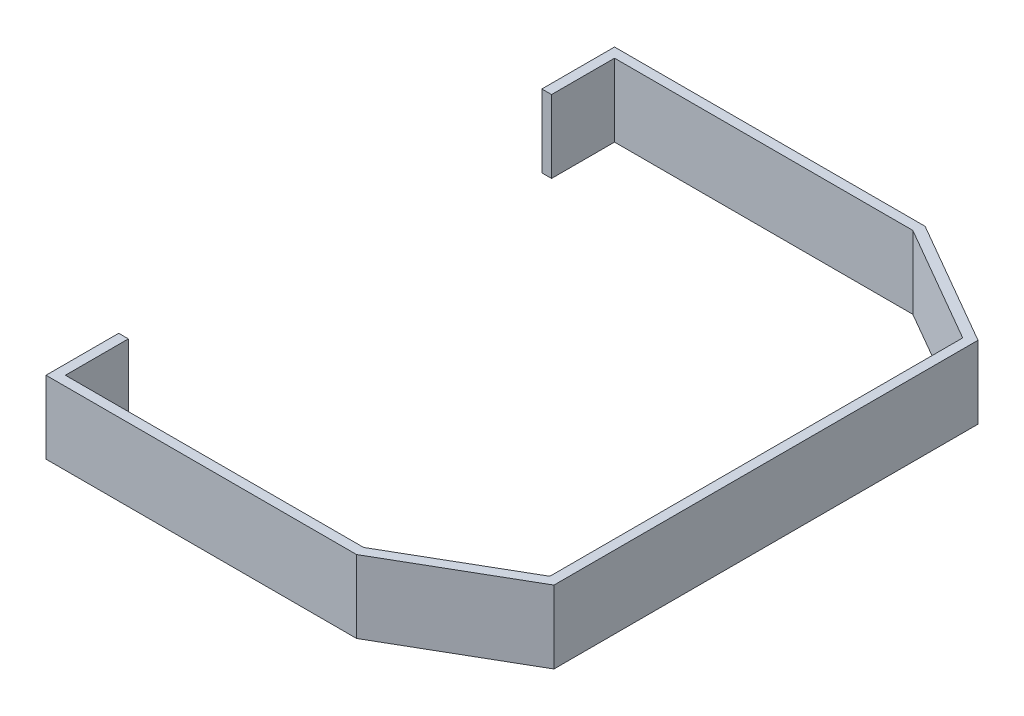
ISO-10303-21;
HEADER;
FILE_DESCRIPTION(('STEP AP214'),'2;1');
FILE_NAME('part.step','',(''),(''),'','','');
FILE_SCHEMA(('AUTOMOTIVE_DESIGN { 1 0 10303 214 1 1 1 1 }'));
ENDSEC;
DATA;
#1=APPLICATION_CONTEXT('core data for automotive mechanical design processes');
#2=APPLICATION_PROTOCOL_DEFINITION('international standard','automotive_design',2000,#1);
#3=PRODUCT_CONTEXT('',#1,'mechanical');
#4=PRODUCT('Part','Part','',(#3));
#5=PRODUCT_RELATED_PRODUCT_CATEGORY('part','',(#4));
#6=PRODUCT_DEFINITION_FORMATION('','',#4);
#7=PRODUCT_DEFINITION_CONTEXT('part definition',#1,'design');
#8=PRODUCT_DEFINITION('design','',#6,#7);
#9=PRODUCT_DEFINITION_SHAPE('','',#8);
#10=(LENGTH_UNIT() NAMED_UNIT(*) SI_UNIT(.MILLI.,.METRE.));
#11=(NAMED_UNIT(*) PLANE_ANGLE_UNIT() SI_UNIT($,.RADIAN.));
#12=(NAMED_UNIT(*) SI_UNIT($,.STERADIAN.) SOLID_ANGLE_UNIT());
#13=UNCERTAINTY_MEASURE_WITH_UNIT(LENGTH_MEASURE(1.E-05),#10,'distance_accuracy_value','');
#14=(GEOMETRIC_REPRESENTATION_CONTEXT(3) GLOBAL_UNCERTAINTY_ASSIGNED_CONTEXT((#13)) GLOBAL_UNIT_ASSIGNED_CONTEXT((#10,
#11,#12)) REPRESENTATION_CONTEXT('',''));
#15=CARTESIAN_POINT('',(0.,0.,0.));
#16=DIRECTION('',(0.,0.,1.));
#17=DIRECTION('',(1.,0.,0.));
#18=AXIS2_PLACEMENT_3D('',#15,#16,#17);
#19=CARTESIAN_POINT('',(-37.5,30.,-117.32));
#20=DIRECTION('',(1.,0.,0.));
#21=DIRECTION('',(0.,0.,-1.));
#22=AXIS2_PLACEMENT_3D('',#19,#20,#21);
#23=PLANE('',#22);
#24=DIRECTION('',(0.,0.,1.));
#25=VECTOR('',#24,1.);
#26=CARTESIAN_POINT('',(-37.5,0.,-117.32));
#27=LINE('',#26,#25);
#28=CARTESIAN_POINT('',(-37.5,0.,-117.32));
#29=VERTEX_POINT('',#28);
#30=CARTESIAN_POINT('',(-37.5,0.,-87.3199999999999));
#31=VERTEX_POINT('',#30);
#32=EDGE_CURVE('E182',#29,#31,#27,.T.);
#33=ORIENTED_EDGE('',*,*,#32,.T.);
#34=DIRECTION('',(0.,-1.,0.));
#35=VECTOR('',#34,1.);
#36=CARTESIAN_POINT('',(-37.5,30.,-87.3199999999999));
#37=LINE('',#36,#35);
#38=CARTESIAN_POINT('',(-37.5,30.,-87.3199999999999));
#39=VERTEX_POINT('',#38);
#40=EDGE_CURVE('E11',#39,#31,#37,.T.);
#41=ORIENTED_EDGE('',*,*,#40,.F.);
#42=DIRECTION('',(0.,0.,1.));
#43=VECTOR('',#42,1.);
#44=CARTESIAN_POINT('',(-37.5,30.,-117.32));
#45=LINE('',#44,#43);
#46=CARTESIAN_POINT('',(-37.5,30.,-117.32));
#47=VERTEX_POINT('',#46);
#48=EDGE_CURVE('E216',#47,#39,#45,.T.);
#49=ORIENTED_EDGE('',*,*,#48,.F.);
#50=DIRECTION('',(0.,-1.,0.));
#51=VECTOR('',#50,1.);
#52=CARTESIAN_POINT('',(-37.5,30.,-117.32));
#53=LINE('',#52,#51);
#54=EDGE_CURVE('E178',#47,#29,#53,.T.);
#55=ORIENTED_EDGE('',*,*,#54,.T.);
#56=EDGE_LOOP('',(#33,#41,#49,#55));
#57=FACE_BOUND('',#56,.T.);
#58=ADVANCED_FACE('F37',(#57),#23,.F.);
#59=CARTESIAN_POINT('',(-37.5,30.,-87.3199999999999));
#60=DIRECTION('',(0.,0.,-1.));
#61=DIRECTION('',(-1.,0.,0.));
#62=AXIS2_PLACEMENT_3D('',#59,#60,#61);
#63=PLANE('',#62);
#64=DIRECTION('',(1.,0.,0.));
#65=VECTOR('',#64,1.);
#66=CARTESIAN_POINT('',(-37.5,0.,-87.3199999999999));
#67=LINE('',#66,#65);
#68=CARTESIAN_POINT('',(-33.5,0.,-87.3199999999999));
#69=VERTEX_POINT('',#68);
#70=EDGE_CURVE('E185',#31,#69,#67,.T.);
#71=ORIENTED_EDGE('',*,*,#70,.T.);
#72=DIRECTION('',(0.,-1.,0.));
#73=VECTOR('',#72,1.);
#74=CARTESIAN_POINT('',(-33.5,30.,-87.3199999999999));
#75=LINE('',#74,#73);
#76=CARTESIAN_POINT('',(-33.5,30.,-87.3199999999999));
#77=VERTEX_POINT('',#76);
#78=EDGE_CURVE('E45',#77,#69,#75,.T.);
#79=ORIENTED_EDGE('',*,*,#78,.F.);
#80=DIRECTION('',(1.,0.,0.));
#81=VECTOR('',#80,1.);
#82=CARTESIAN_POINT('',(-37.5,30.,-87.3199999999999));
#83=LINE('',#82,#81);
#84=EDGE_CURVE('E118',#39,#77,#83,.T.);
#85=ORIENTED_EDGE('',*,*,#84,.F.);
#86=ORIENTED_EDGE('',*,*,#40,.T.);
#87=EDGE_LOOP('',(#71,#79,#85,#86));
#88=FACE_BOUND('',#87,.T.);
#89=ADVANCED_FACE('F302',(#88),#63,.F.);
#90=CARTESIAN_POINT('',(-33.5,30.,-87.3199999999999));
#91=DIRECTION('',(-1.,0.,0.));
#92=DIRECTION('',(0.,0.,1.));
#93=AXIS2_PLACEMENT_3D('',#90,#91,#92);
#94=PLANE('',#93);
#95=DIRECTION('',(0.,0.,-1.));
#96=VECTOR('',#95,1.);
#97=CARTESIAN_POINT('',(-33.5,0.,-87.3199999999999));
#98=LINE('',#97,#96);
#99=CARTESIAN_POINT('',(-33.5,0.,-113.32));
#100=VERTEX_POINT('',#99);
#101=EDGE_CURVE('E187',#69,#100,#98,.T.);
#102=ORIENTED_EDGE('',*,*,#101,.T.);
#103=DIRECTION('',(0.,-1.,0.));
#104=VECTOR('',#103,1.);
#105=CARTESIAN_POINT('',(-33.5,30.,-113.32));
#106=LINE('',#105,#104);
#107=CARTESIAN_POINT('',(-33.5,30.,-113.32));
#108=VERTEX_POINT('',#107);
#109=EDGE_CURVE('E247',#108,#100,#106,.T.);
#110=ORIENTED_EDGE('',*,*,#109,.F.);
#111=DIRECTION('',(0.,0.,-1.));
#112=VECTOR('',#111,1.);
#113=CARTESIAN_POINT('',(-33.5,30.,-87.3199999999999));
#114=LINE('',#113,#112);
#115=EDGE_CURVE('E255',#77,#108,#114,.T.);
#116=ORIENTED_EDGE('',*,*,#115,.F.);
#117=ORIENTED_EDGE('',*,*,#78,.T.);
#118=EDGE_LOOP('',(#102,#110,#116,#117));
#119=FACE_BOUND('',#118,.T.);
#120=ADVANCED_FACE('F253',(#119),#94,.F.);
#121=CARTESIAN_POINT('',(0.,30.,-113.32));
#122=DIRECTION('',(0.,0.,-1.));
#123=DIRECTION('',(-1.,0.,0.));
#124=AXIS2_PLACEMENT_3D('',#121,#122,#123);
#125=PLANE('',#124);
#126=DIRECTION('',(1.,0.,0.));
#127=VECTOR('',#126,1.);
#128=CARTESIAN_POINT('',(0.,0.,-113.32));
#129=LINE('',#128,#127);
#130=CARTESIAN_POINT('',(89.5982032302755,0.,-113.32));
#131=VERTEX_POINT('',#130);
#132=EDGE_CURVE('E190',#100,#131,#129,.T.);
#133=ORIENTED_EDGE('',*,*,#132,.T.);
#134=DIRECTION('',(0.,-1.,0.));
#135=VECTOR('',#134,1.);
#136=CARTESIAN_POINT('',(89.5982032302755,30.,-113.32));
#137=LINE('',#136,#135);
#138=CARTESIAN_POINT('',(89.5982032302755,30.,-113.32));
#139=VERTEX_POINT('',#138);
#140=EDGE_CURVE('E244',#139,#131,#137,.T.);
#141=ORIENTED_EDGE('',*,*,#140,.F.);
#142=DIRECTION('',(1.,0.,0.));
#143=VECTOR('',#142,1.);
#144=CARTESIAN_POINT('',(0.,30.,-113.32));
#145=LINE('',#144,#143);
#146=EDGE_CURVE('E270',#108,#139,#145,.T.);
#147=ORIENTED_EDGE('',*,*,#146,.F.);
#148=ORIENTED_EDGE('',*,*,#109,.T.);
#149=EDGE_LOOP('',(#133,#141,#147,#148));
#150=FACE_BOUND('',#149,.T.);
#151=ADVANCED_FACE('F261',(#150),#125,.F.);
#152=CARTESIAN_POINT('',(89.5982032302755,30.,-113.32));
#153=DIRECTION('',(0.5,0.,-0.866025403784438));
#154=DIRECTION('',(-0.866025403784439,0.,-0.5));
#155=AXIS2_PLACEMENT_3D('',#152,#153,#154);
#156=PLANE('',#155);
#157=DIRECTION('',(0.866025403784439,0.,0.5));
#158=VECTOR('',#157,1.);
#159=CARTESIAN_POINT('',(89.5982032302755,0.,-113.32));
#160=LINE('',#159,#158);
#161=CARTESIAN_POINT('',(138.319755081704,0.,-85.1905989232414));
#162=VERTEX_POINT('',#161);
#163=EDGE_CURVE('E192',#131,#162,#160,.T.);
#164=ORIENTED_EDGE('',*,*,#163,.T.);
#165=DIRECTION('',(0.,-1.,0.));
#166=VECTOR('',#165,1.);
#167=CARTESIAN_POINT('',(138.319755081704,30.,-85.1905989232414));
#168=LINE('',#167,#166);
#169=CARTESIAN_POINT('',(138.319755081704,30.,-85.1905989232414));
#170=VERTEX_POINT('',#169);
#171=EDGE_CURVE('E241',#170,#162,#168,.T.);
#172=ORIENTED_EDGE('',*,*,#171,.F.);
#173=DIRECTION('',(0.866025403784439,0.,0.5));
#174=VECTOR('',#173,1.);
#175=CARTESIAN_POINT('',(89.5982032302755,30.,-113.32));
#176=LINE('',#175,#174);
#177=EDGE_CURVE('E267',#139,#170,#176,.T.);
#178=ORIENTED_EDGE('',*,*,#177,.F.);
#179=ORIENTED_EDGE('',*,*,#140,.T.);
#180=EDGE_LOOP('',(#164,#172,#178,#179));
#181=FACE_BOUND('',#180,.T.);
#182=ADVANCED_FACE('F265',(#181),#156,.F.);
#183=CARTESIAN_POINT('',(138.319755081704,30.,-85.1905989232414));
#184=DIRECTION('',(1.,0.,0.));
#185=DIRECTION('',(0.,0.,-1.));
#186=AXIS2_PLACEMENT_3D('',#183,#184,#185);
#187=PLANE('',#186);
#188=DIRECTION('',(0.,0.,1.));
#189=VECTOR('',#188,1.);
#190=CARTESIAN_POINT('',(138.319755081704,0.,-85.1905989232414));
#191=LINE('',#190,#189);
#192=CARTESIAN_POINT('',(138.319755081704,0.,85.1905989232415));
#193=VERTEX_POINT('',#192);
#194=EDGE_CURVE('E194',#162,#193,#191,.T.);
#195=ORIENTED_EDGE('',*,*,#194,.T.);
#196=DIRECTION('',(0.,-1.,0.));
#197=VECTOR('',#196,1.);
#198=CARTESIAN_POINT('',(138.319755081704,30.,85.1905989232415));
#199=LINE('',#198,#197);
#200=CARTESIAN_POINT('',(138.319755081704,30.,85.1905989232415));
#201=VERTEX_POINT('',#200);
#202=EDGE_CURVE('E238',#201,#193,#199,.T.);
#203=ORIENTED_EDGE('',*,*,#202,.F.);
#204=DIRECTION('',(0.,0.,1.));
#205=VECTOR('',#204,1.);
#206=CARTESIAN_POINT('',(138.319755081704,30.,-85.1905989232414));
#207=LINE('',#206,#205);
#208=EDGE_CURVE('E269',#170,#201,#207,.T.);
#209=ORIENTED_EDGE('',*,*,#208,.F.);
#210=ORIENTED_EDGE('',*,*,#171,.T.);
#211=EDGE_LOOP('',(#195,#203,#209,#210));
#212=FACE_BOUND('',#211,.T.);
#213=ADVANCED_FACE('F314',(#212),#187,.F.);
#214=CARTESIAN_POINT('',(138.319755081704,30.,85.1905989232415));
#215=DIRECTION('',(0.5,0.,0.866025403784438));
#216=DIRECTION('',(0.866025403784439,0.,-0.5));
#217=AXIS2_PLACEMENT_3D('',#214,#215,#216);
#218=PLANE('',#217);
#219=DIRECTION('',(-0.866025403784438,0.,0.5));
#220=VECTOR('',#219,1.);
#221=CARTESIAN_POINT('',(138.319755081704,0.,85.1905989232415));
#222=LINE('',#221,#220);
#223=CARTESIAN_POINT('',(89.5982032302757,0.,113.32));
#224=VERTEX_POINT('',#223);
#225=EDGE_CURVE('E196',#193,#224,#222,.T.);
#226=ORIENTED_EDGE('',*,*,#225,.T.);
#227=DIRECTION('',(0.,-1.,0.));
#228=VECTOR('',#227,1.);
#229=CARTESIAN_POINT('',(89.5982032302757,30.,113.32));
#230=LINE('',#229,#228);
#231=CARTESIAN_POINT('',(89.5982032302757,30.,113.32));
#232=VERTEX_POINT('',#231);
#233=EDGE_CURVE('E235',#232,#224,#230,.T.);
#234=ORIENTED_EDGE('',*,*,#233,.F.);
#235=DIRECTION('',(-0.866025403784438,0.,0.5));
#236=VECTOR('',#235,1.);
#237=CARTESIAN_POINT('',(138.319755081704,30.,85.1905989232415));
#238=LINE('',#237,#236);
#239=EDGE_CURVE('E272',#201,#232,#238,.T.);
#240=ORIENTED_EDGE('',*,*,#239,.F.);
#241=ORIENTED_EDGE('',*,*,#202,.T.);
#242=EDGE_LOOP('',(#226,#234,#240,#241));
#243=FACE_BOUND('',#242,.T.);
#244=ADVANCED_FACE('F317',(#243),#218,.F.);
#245=CARTESIAN_POINT('',(-33.5,30.,113.32));
#246=DIRECTION('',(0.,0.,1.));
#247=DIRECTION('',(1.,0.,0.));
#248=AXIS2_PLACEMENT_3D('',#245,#246,#247);
#249=PLANE('',#248);
#250=DIRECTION('',(-1.,0.,0.));
#251=VECTOR('',#250,1.);
#252=CARTESIAN_POINT('',(-33.5,0.,113.32));
#253=LINE('',#252,#251);
#254=CARTESIAN_POINT('',(-33.5,0.,113.32));
#255=VERTEX_POINT('',#254);
#256=EDGE_CURVE('E199',#224,#255,#253,.T.);
#257=ORIENTED_EDGE('',*,*,#256,.T.);
#258=DIRECTION('',(0.,-1.,0.));
#259=VECTOR('',#258,1.);
#260=CARTESIAN_POINT('',(-33.5,30.,113.32));
#261=LINE('',#260,#259);
#262=CARTESIAN_POINT('',(-33.5,30.,113.32));
#263=VERTEX_POINT('',#262);
#264=EDGE_CURVE('E232',#263,#255,#261,.T.);
#265=ORIENTED_EDGE('',*,*,#264,.F.);
#266=DIRECTION('',(-1.,0.,0.));
#267=VECTOR('',#266,1.);
#268=CARTESIAN_POINT('',(89.5982032302757,30.,113.32));
#269=LINE('',#268,#267);
#270=EDGE_CURVE('E278',#232,#263,#269,.T.);
#271=ORIENTED_EDGE('',*,*,#270,.F.);
#272=ORIENTED_EDGE('',*,*,#233,.T.);
#273=EDGE_LOOP('',(#257,#265,#271,#272));
#274=FACE_BOUND('',#273,.T.);
#275=ADVANCED_FACE('F321',(#274),#249,.F.);
#276=CARTESIAN_POINT('',(-33.5,30.,87.3199999999999));
#277=DIRECTION('',(-1.,0.,0.));
#278=DIRECTION('',(0.,0.,1.));
#279=AXIS2_PLACEMENT_3D('',#276,#277,#278);
#280=PLANE('',#279);
#281=DIRECTION('',(0.,0.,-1.));
#282=VECTOR('',#281,1.);
#283=CARTESIAN_POINT('',(-33.5,0.,87.3199999999999));
#284=LINE('',#283,#282);
#285=CARTESIAN_POINT('',(-33.5,0.,87.3199999999999));
#286=VERTEX_POINT('',#285);
#287=EDGE_CURVE('E201',#255,#286,#284,.T.);
#288=ORIENTED_EDGE('',*,*,#287,.T.);
#289=DIRECTION('',(0.,-1.,0.));
#290=VECTOR('',#289,1.);
#291=CARTESIAN_POINT('',(-33.5,30.,87.3199999999999));
#292=LINE('',#291,#290);
#293=CARTESIAN_POINT('',(-33.5,30.,87.3199999999999));
#294=VERTEX_POINT('',#293);
#295=EDGE_CURVE('E229',#294,#286,#292,.T.);
#296=ORIENTED_EDGE('',*,*,#295,.F.);
#297=DIRECTION('',(0.,0.,-1.));
#298=VECTOR('',#297,1.);
#299=CARTESIAN_POINT('',(-33.5,30.,87.3199999999999));
#300=LINE('',#299,#298);
#301=EDGE_CURVE('E280',#263,#294,#300,.T.);
#302=ORIENTED_EDGE('',*,*,#301,.F.);
#303=ORIENTED_EDGE('',*,*,#264,.T.);
#304=EDGE_LOOP('',(#288,#296,#302,#303));
#305=FACE_BOUND('',#304,.T.);
#306=ADVANCED_FACE('F325',(#305),#280,.F.);
#307=CARTESIAN_POINT('',(-37.5,30.,87.3199999999999));
#308=DIRECTION('',(0.,0.,1.));
#309=DIRECTION('',(1.,0.,0.));
#310=AXIS2_PLACEMENT_3D('',#307,#308,#309);
#311=PLANE('',#310);
#312=DIRECTION('',(-1.,0.,0.));
#313=VECTOR('',#312,1.);
#314=CARTESIAN_POINT('',(-37.5,0.,87.3199999999999));
#315=LINE('',#314,#313);
#316=CARTESIAN_POINT('',(-37.5,0.,87.3199999999999));
#317=VERTEX_POINT('',#316);
#318=EDGE_CURVE('E203',#286,#317,#315,.T.);
#319=ORIENTED_EDGE('',*,*,#318,.T.);
#320=DIRECTION('',(0.,-1.,0.));
#321=VECTOR('',#320,1.);
#322=CARTESIAN_POINT('',(-37.5,30.,87.3199999999999));
#323=LINE('',#322,#321);
#324=CARTESIAN_POINT('',(-37.5,30.,87.3199999999999));
#325=VERTEX_POINT('',#324);
#326=EDGE_CURVE('E226',#325,#317,#323,.T.);
#327=ORIENTED_EDGE('',*,*,#326,.F.);
#328=DIRECTION('',(-1.,0.,0.));
#329=VECTOR('',#328,1.);
#330=CARTESIAN_POINT('',(-37.5,30.,87.3199999999999));
#331=LINE('',#330,#329);
#332=EDGE_CURVE('E282',#294,#325,#331,.T.);
#333=ORIENTED_EDGE('',*,*,#332,.F.);
#334=ORIENTED_EDGE('',*,*,#295,.T.);
#335=EDGE_LOOP('',(#319,#327,#333,#334));
#336=FACE_BOUND('',#335,.T.);
#337=ADVANCED_FACE('F329',(#336),#311,.F.);
#338=CARTESIAN_POINT('',(-37.5,30.,117.32));
#339=DIRECTION('',(1.,0.,0.));
#340=DIRECTION('',(0.,0.,-1.));
#341=AXIS2_PLACEMENT_3D('',#338,#339,#340);
#342=PLANE('',#341);
#343=DIRECTION('',(0.,0.,1.));
#344=VECTOR('',#343,1.);
#345=CARTESIAN_POINT('',(-37.5,0.,117.32));
#346=LINE('',#345,#344);
#347=CARTESIAN_POINT('',(-37.5,0.,117.32));
#348=VERTEX_POINT('',#347);
#349=EDGE_CURVE('E205',#317,#348,#346,.T.);
#350=ORIENTED_EDGE('',*,*,#349,.T.);
#351=DIRECTION('',(0.,-1.,0.));
#352=VECTOR('',#351,1.);
#353=CARTESIAN_POINT('',(-37.5,30.,117.32));
#354=LINE('',#353,#352);
#355=CARTESIAN_POINT('',(-37.5,30.,117.32));
#356=VERTEX_POINT('',#355);
#357=EDGE_CURVE('E223',#356,#348,#354,.T.);
#358=ORIENTED_EDGE('',*,*,#357,.F.);
#359=DIRECTION('',(0.,0.,1.));
#360=VECTOR('',#359,1.);
#361=CARTESIAN_POINT('',(-37.5,30.,117.32));
#362=LINE('',#361,#360);
#363=EDGE_CURVE('E284',#325,#356,#362,.T.);
#364=ORIENTED_EDGE('',*,*,#363,.F.);
#365=ORIENTED_EDGE('',*,*,#326,.T.);
#366=EDGE_LOOP('',(#350,#358,#364,#365));
#367=FACE_BOUND('',#366,.T.);
#368=ADVANCED_FACE('F333',(#367),#342,.F.);
#369=CARTESIAN_POINT('',(90.67,30.,117.32));
#370=DIRECTION('',(0.,0.,-1.));
#371=DIRECTION('',(-1.,0.,0.));
#372=AXIS2_PLACEMENT_3D('',#369,#370,#371);
#373=PLANE('',#372);
#374=DIRECTION('',(1.,0.,0.));
#375=VECTOR('',#374,1.);
#376=CARTESIAN_POINT('',(90.67,0.,117.32));
#377=LINE('',#376,#375);
#378=CARTESIAN_POINT('',(90.67,0.,117.32));
#379=VERTEX_POINT('',#378);
#380=EDGE_CURVE('E208',#348,#379,#377,.T.);
#381=ORIENTED_EDGE('',*,*,#380,.T.);
#382=DIRECTION('',(0.,-1.,0.));
#383=VECTOR('',#382,1.);
#384=CARTESIAN_POINT('',(90.67,30.,117.32));
#385=LINE('',#384,#383);
#386=CARTESIAN_POINT('',(90.67,30.,117.32));
#387=VERTEX_POINT('',#386);
#388=EDGE_CURVE('E220',#387,#379,#385,.T.);
#389=ORIENTED_EDGE('',*,*,#388,.F.);
#390=DIRECTION('',(1.,0.,0.));
#391=VECTOR('',#390,1.);
#392=CARTESIAN_POINT('',(-37.5,30.,117.32));
#393=LINE('',#392,#391);
#394=EDGE_CURVE('E286',#356,#387,#393,.T.);
#395=ORIENTED_EDGE('',*,*,#394,.F.);
#396=ORIENTED_EDGE('',*,*,#357,.T.);
#397=EDGE_LOOP('',(#381,#389,#395,#396));
#398=FACE_BOUND('',#397,.T.);
#399=ADVANCED_FACE('F292',(#398),#373,.F.);
#400=CARTESIAN_POINT('',(142.319755081704,30.,87.5));
#401=DIRECTION('',(-0.499999999999999,0.,-0.866025403784439));
#402=DIRECTION('',(-0.866025403784439,0.,0.499999999999999));
#403=AXIS2_PLACEMENT_3D('',#400,#401,#402);
#404=PLANE('',#403);
#405=DIRECTION('',(0.866025403784439,0.,-0.499999999999999));
#406=VECTOR('',#405,1.);
#407=CARTESIAN_POINT('',(142.319755081704,0.,87.5));
#408=LINE('',#407,#406);
#409=CARTESIAN_POINT('',(142.319755081704,0.,87.5));
#410=VERTEX_POINT('',#409);
#411=EDGE_CURVE('E210',#379,#410,#408,.T.);
#412=ORIENTED_EDGE('',*,*,#411,.T.);
#413=DIRECTION('',(0.,-1.,0.));
#414=VECTOR('',#413,1.);
#415=CARTESIAN_POINT('',(142.319755081704,30.,87.5));
#416=LINE('',#415,#414);
#417=CARTESIAN_POINT('',(142.319755081704,30.,87.5));
#418=VERTEX_POINT('',#417);
#419=EDGE_CURVE('E173',#418,#410,#416,.T.);
#420=ORIENTED_EDGE('',*,*,#419,.F.);
#421=DIRECTION('',(0.866025403784439,0.,-0.499999999999999));
#422=VECTOR('',#421,1.);
#423=CARTESIAN_POINT('',(142.319755081704,30.,87.5));
#424=LINE('',#423,#422);
#425=EDGE_CURVE('E162',#387,#418,#424,.T.);
#426=ORIENTED_EDGE('',*,*,#425,.F.);
#427=ORIENTED_EDGE('',*,*,#388,.T.);
#428=EDGE_LOOP('',(#412,#420,#426,#427));
#429=FACE_BOUND('',#428,.T.);
#430=ADVANCED_FACE('F295',(#429),#404,.F.);
#431=CARTESIAN_POINT('',(142.319755081704,30.,-87.5));
#432=DIRECTION('',(-1.,0.,0.));
#433=DIRECTION('',(0.,0.,1.));
#434=AXIS2_PLACEMENT_3D('',#431,#432,#433);
#435=PLANE('',#434);
#436=DIRECTION('',(0.,0.,-1.));
#437=VECTOR('',#436,1.);
#438=CARTESIAN_POINT('',(142.319755081704,0.,-87.5));
#439=LINE('',#438,#437);
#440=CARTESIAN_POINT('',(142.319755081704,0.,-87.5));
#441=VERTEX_POINT('',#440);
#442=EDGE_CURVE('E171',#410,#441,#439,.T.);
#443=ORIENTED_EDGE('',*,*,#442,.T.);
#444=DIRECTION('',(0.,-1.,0.));
#445=VECTOR('',#444,1.);
#446=CARTESIAN_POINT('',(142.319755081704,30.,-87.5));
#447=LINE('',#446,#445);
#448=CARTESIAN_POINT('',(142.319755081704,30.,-87.5));
#449=VERTEX_POINT('',#448);
#450=EDGE_CURVE('E168',#449,#441,#447,.T.);
#451=ORIENTED_EDGE('',*,*,#450,.F.);
#452=DIRECTION('',(0.,0.,-1.));
#453=VECTOR('',#452,1.);
#454=CARTESIAN_POINT('',(142.319755081704,30.,-87.5));
#455=LINE('',#454,#453);
#456=EDGE_CURVE('E155',#418,#449,#455,.T.);
#457=ORIENTED_EDGE('',*,*,#456,.F.);
#458=ORIENTED_EDGE('',*,*,#419,.T.);
#459=EDGE_LOOP('',(#443,#451,#457,#458));
#460=FACE_BOUND('',#459,.T.);
#461=ADVANCED_FACE('F169',(#460),#435,.F.);
#462=CARTESIAN_POINT('',(90.67,30.,-117.32));
#463=DIRECTION('',(-0.499999999999999,0.,0.866025403784439));
#464=DIRECTION('',(0.866025403784439,0.,0.499999999999999));
#465=AXIS2_PLACEMENT_3D('',#462,#463,#464);
#466=PLANE('',#465);
#467=DIRECTION('',(-0.866025403784439,0.,-0.499999999999999));
#468=VECTOR('',#467,1.);
#469=CARTESIAN_POINT('',(90.67,0.,-117.32));
#470=LINE('',#469,#468);
#471=CARTESIAN_POINT('',(90.67,0.,-117.32));
#472=VERTEX_POINT('',#471);
#473=EDGE_CURVE('E213',#441,#472,#470,.T.);
#474=ORIENTED_EDGE('',*,*,#473,.T.);
#475=DIRECTION('',(0.,-1.,0.));
#476=VECTOR('',#475,1.);
#477=CARTESIAN_POINT('',(90.67,30.,-117.32));
#478=LINE('',#477,#476);
#479=CARTESIAN_POINT('',(90.67,30.,-117.32));
#480=VERTEX_POINT('',#479);
#481=EDGE_CURVE('E174',#480,#472,#478,.T.);
#482=ORIENTED_EDGE('',*,*,#481,.F.);
#483=DIRECTION('',(-0.866025403784439,0.,-0.499999999999999));
#484=VECTOR('',#483,1.);
#485=CARTESIAN_POINT('',(90.67,30.,-117.32));
#486=LINE('',#485,#484);
#487=EDGE_CURVE('E159',#449,#480,#486,.T.);
#488=ORIENTED_EDGE('',*,*,#487,.F.);
#489=ORIENTED_EDGE('',*,*,#450,.T.);
#490=EDGE_LOOP('',(#474,#482,#488,#489));
#491=FACE_BOUND('',#490,.T.);
#492=ADVANCED_FACE('F176',(#491),#466,.F.);
#493=CARTESIAN_POINT('',(0.,30.,-117.32));
#494=DIRECTION('',(0.,0.,1.));
#495=DIRECTION('',(1.,0.,0.));
#496=AXIS2_PLACEMENT_3D('',#493,#494,#495);
#497=PLANE('',#496);
#498=DIRECTION('',(-1.,0.,0.));
#499=VECTOR('',#498,1.);
#500=CARTESIAN_POINT('',(0.,0.,-117.32));
#501=LINE('',#500,#499);
#502=EDGE_CURVE('E106',#472,#29,#501,.T.);
#503=ORIENTED_EDGE('',*,*,#502,.T.);
#504=ORIENTED_EDGE('',*,*,#54,.F.);
#505=DIRECTION('',(-1.,0.,0.));
#506=VECTOR('',#505,1.);
#507=CARTESIAN_POINT('',(0.,30.,-117.32));
#508=LINE('',#507,#506);
#509=EDGE_CURVE('E53',#480,#47,#508,.T.);
#510=ORIENTED_EDGE('',*,*,#509,.F.);
#511=ORIENTED_EDGE('',*,*,#481,.T.);
#512=EDGE_LOOP('',(#503,#504,#510,#511));
#513=FACE_BOUND('',#512,.T.);
#514=ADVANCED_FACE('F296',(#513),#497,.F.);
#515=CARTESIAN_POINT('',(0.,30.,0.));
#516=DIRECTION('',(0.,1.,0.));
#517=DIRECTION('',(0.,0.,1.));
#518=AXIS2_PLACEMENT_3D('',#515,#516,#517);
#519=PLANE('',#518);
#520=ORIENTED_EDGE('',*,*,#48,.T.);
#521=ORIENTED_EDGE('',*,*,#84,.T.);
#522=ORIENTED_EDGE('',*,*,#115,.T.);
#523=ORIENTED_EDGE('',*,*,#146,.T.);
#524=ORIENTED_EDGE('',*,*,#177,.T.);
#525=ORIENTED_EDGE('',*,*,#208,.T.);
#526=ORIENTED_EDGE('',*,*,#239,.T.);
#527=ORIENTED_EDGE('',*,*,#270,.T.);
#528=ORIENTED_EDGE('',*,*,#301,.T.);
#529=ORIENTED_EDGE('',*,*,#332,.T.);
#530=ORIENTED_EDGE('',*,*,#363,.T.);
#531=ORIENTED_EDGE('',*,*,#394,.T.);
#532=ORIENTED_EDGE('',*,*,#425,.T.);
#533=ORIENTED_EDGE('',*,*,#456,.T.);
#534=ORIENTED_EDGE('',*,*,#487,.T.);
#535=ORIENTED_EDGE('',*,*,#509,.T.);
#536=EDGE_LOOP('',(#520,#521,#522,#523,#524,#525,#526,#527,#528,#529,#530,#531,#532,#533,#534,#535));
#537=FACE_BOUND('',#536,.T.);
#538=ADVANCED_FACE('F157',(#537),#519,.T.);
#539=CARTESIAN_POINT('',(0.,0.,0.));
#540=DIRECTION('',(0.,1.,0.));
#541=DIRECTION('',(0.,0.,1.));
#542=AXIS2_PLACEMENT_3D('',#539,#540,#541);
#543=PLANE('',#542);
#544=ORIENTED_EDGE('',*,*,#32,.F.);
#545=ORIENTED_EDGE('',*,*,#502,.F.);
#546=ORIENTED_EDGE('',*,*,#473,.F.);
#547=ORIENTED_EDGE('',*,*,#442,.F.);
#548=ORIENTED_EDGE('',*,*,#411,.F.);
#549=ORIENTED_EDGE('',*,*,#380,.F.);
#550=ORIENTED_EDGE('',*,*,#349,.F.);
#551=ORIENTED_EDGE('',*,*,#318,.F.);
#552=ORIENTED_EDGE('',*,*,#287,.F.);
#553=ORIENTED_EDGE('',*,*,#256,.F.);
#554=ORIENTED_EDGE('',*,*,#225,.F.);
#555=ORIENTED_EDGE('',*,*,#194,.F.);
#556=ORIENTED_EDGE('',*,*,#163,.F.);
#557=ORIENTED_EDGE('',*,*,#132,.F.);
#558=ORIENTED_EDGE('',*,*,#101,.F.);
#559=ORIENTED_EDGE('',*,*,#70,.F.);
#560=EDGE_LOOP('',(#544,#545,#546,#547,#548,#549,#550,#551,#552,#553,#554,#555,#556,#557,#558,#559));
#561=FACE_BOUND('',#560,.T.);
#562=ADVANCED_FACE('F256',(#561),#543,.F.);
#563=CLOSED_SHELL('',(#58,#89,#120,#151,#182,#213,#244,#275,#306,#337,#368,#399,#430,#461,#492,
#514,#538,#562));
#564=MANIFOLD_SOLID_BREP('B2',#563);
#565=ADVANCED_BREP_SHAPE_REPRESENTATION('',(#18,#564),#14);
#566=SHAPE_DEFINITION_REPRESENTATION(#9,#565);
ENDSEC;
END-ISO-10303-21;
